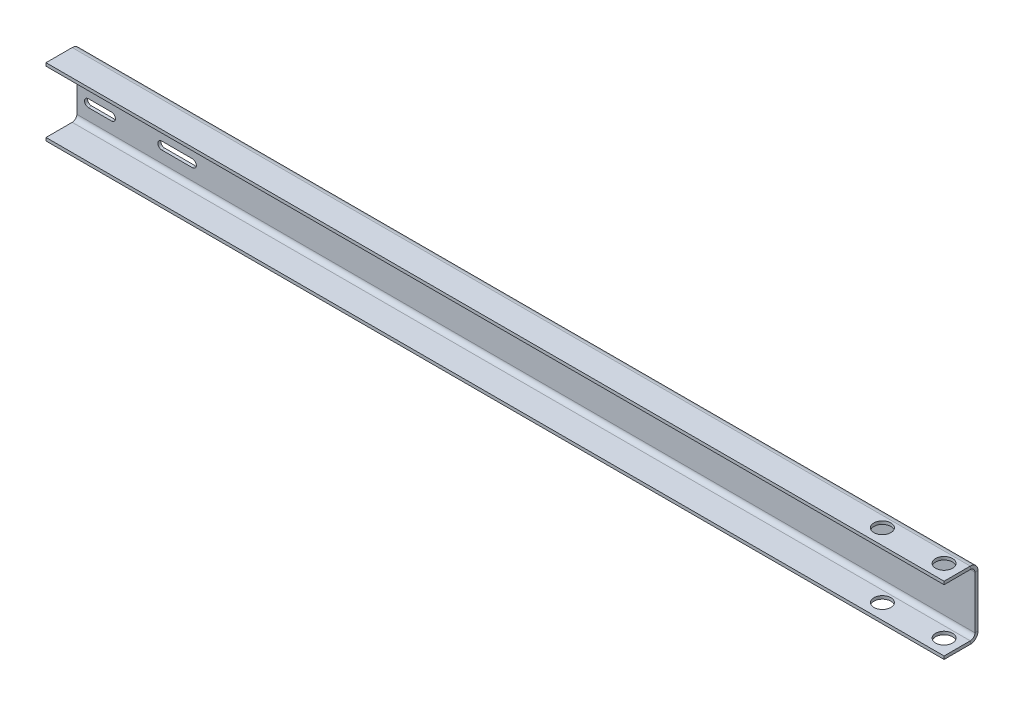
ISO-10303-21;
HEADER;
FILE_DESCRIPTION(('STEP AP214'),'2;1');
FILE_NAME('part.step','',(''),(''),'','','');
FILE_SCHEMA(('AUTOMOTIVE_DESIGN { 1 0 10303 214 1 1 1 1 }'));
ENDSEC;
DATA;
#1=APPLICATION_CONTEXT('core data for automotive mechanical design processes');
#2=APPLICATION_PROTOCOL_DEFINITION('international standard','automotive_design',2000,#1);
#3=PRODUCT_CONTEXT('',#1,'mechanical');
#4=PRODUCT('Part','Part','',(#3));
#5=PRODUCT_RELATED_PRODUCT_CATEGORY('part','',(#4));
#6=PRODUCT_DEFINITION_FORMATION('','',#4);
#7=PRODUCT_DEFINITION_CONTEXT('part definition',#1,'design');
#8=PRODUCT_DEFINITION('design','',#6,#7);
#9=PRODUCT_DEFINITION_SHAPE('','',#8);
#10=(LENGTH_UNIT() NAMED_UNIT(*) SI_UNIT(.MILLI.,.METRE.));
#11=(NAMED_UNIT(*) PLANE_ANGLE_UNIT() SI_UNIT($,.RADIAN.));
#12=(NAMED_UNIT(*) SI_UNIT($,.STERADIAN.) SOLID_ANGLE_UNIT());
#13=UNCERTAINTY_MEASURE_WITH_UNIT(LENGTH_MEASURE(1.E-05),#10,'distance_accuracy_value','');
#14=(GEOMETRIC_REPRESENTATION_CONTEXT(3) GLOBAL_UNCERTAINTY_ASSIGNED_CONTEXT((#13)) GLOBAL_UNIT_ASSIGNED_CONTEXT((#10,
#11,#12)) REPRESENTATION_CONTEXT('',''));
#15=CARTESIAN_POINT('',(0.,0.,0.));
#16=DIRECTION('',(0.,0.,1.));
#17=DIRECTION('',(1.,0.,0.));
#18=AXIS2_PLACEMENT_3D('',#15,#16,#17);
#19=CARTESIAN_POINT('',(0.,0.,-4.));
#20=DIRECTION('',(0.,0.,-1.));
#21=DIRECTION('',(-1.,0.,0.));
#22=AXIS2_PLACEMENT_3D('',#19,#20,#21);
#23=PLANE('',#22);
#24=CARTESIAN_POINT('',(-850.518987341773,29.9999999999999,-4.));
#25=DIRECTION('',(0.,0.,-1.));
#26=DIRECTION('',(-1.,0.,0.));
#27=AXIS2_PLACEMENT_3D('',#24,#25,#26);
#28=CIRCLE('',#27,5.);
#29=CARTESIAN_POINT('',(-850.518987341773,24.9999999999999,-4.));
#30=VERTEX_POINT('',#29);
#31=CARTESIAN_POINT('',(-850.518987341773,34.9999999999999,-4.));
#32=VERTEX_POINT('',#31);
#33=EDGE_CURVE('E96',#30,#32,#28,.T.);
#34=ORIENTED_EDGE('',*,*,#33,.F.);
#35=DIRECTION('',(-1.,0.,0.));
#36=VECTOR('',#35,1.);
#37=CARTESIAN_POINT('',(-850.518987341773,24.9999999999999,-4.));
#38=LINE('',#37,#36);
#39=CARTESIAN_POINT('',(-820.518987341773,24.9999999999999,-4.));
#40=VERTEX_POINT('',#39);
#41=EDGE_CURVE('E236',#40,#30,#38,.T.);
#42=ORIENTED_EDGE('',*,*,#41,.F.);
#43=CARTESIAN_POINT('',(-820.518987341773,29.9999999999999,-4.));
#44=DIRECTION('',(0.,0.,-1.));
#45=DIRECTION('',(-1.,0.,0.));
#46=AXIS2_PLACEMENT_3D('',#43,#44,#45);
#47=CIRCLE('',#46,5.);
#48=CARTESIAN_POINT('',(-820.518987341773,34.9999999999999,-4.));
#49=VERTEX_POINT('',#48);
#50=EDGE_CURVE('E221',#49,#40,#47,.T.);
#51=ORIENTED_EDGE('',*,*,#50,.F.);
#52=DIRECTION('',(1.,0.,0.));
#53=VECTOR('',#52,1.);
#54=CARTESIAN_POINT('',(-850.518987341773,34.9999999999999,-4.));
#55=LINE('',#54,#53);
#56=EDGE_CURVE('E230',#32,#49,#55,.T.);
#57=ORIENTED_EDGE('',*,*,#56,.F.);
#58=EDGE_LOOP('',(#34,#42,#51,#57));
#59=FACE_BOUND('',#58,.T.);
#60=CARTESIAN_POINT('',(-755.518987341773,29.9999999999999,-4.));
#61=DIRECTION('',(0.,0.,-1.));
#62=DIRECTION('',(-1.,0.,0.));
#63=AXIS2_PLACEMENT_3D('',#60,#61,#62);
#64=CIRCLE('',#63,4.99999999999999);
#65=CARTESIAN_POINT('',(-755.518987341773,24.9999999999999,-4.));
#66=VERTEX_POINT('',#65);
#67=CARTESIAN_POINT('',(-755.518987341773,34.9999999999999,-4.));
#68=VERTEX_POINT('',#67);
#69=EDGE_CURVE('E243',#66,#68,#64,.T.);
#70=ORIENTED_EDGE('',*,*,#69,.F.);
#71=DIRECTION('',(-1.,0.,0.));
#72=VECTOR('',#71,1.);
#73=CARTESIAN_POINT('',(-755.518987341773,24.9999999999999,-4.));
#74=LINE('',#73,#72);
#75=CARTESIAN_POINT('',(-715.518987341773,24.9999999999999,-4.));
#76=VERTEX_POINT('',#75);
#77=EDGE_CURVE('E253',#76,#66,#74,.T.);
#78=ORIENTED_EDGE('',*,*,#77,.F.);
#79=CARTESIAN_POINT('',(-715.518987341773,29.9999999999999,-4.));
#80=DIRECTION('',(0.,0.,-1.));
#81=DIRECTION('',(-1.,0.,0.));
#82=AXIS2_PLACEMENT_3D('',#79,#80,#81);
#83=CIRCLE('',#82,4.99999999999999);
#84=CARTESIAN_POINT('',(-715.518987341773,34.9999999999999,-4.));
#85=VERTEX_POINT('',#84);
#86=EDGE_CURVE('E250',#85,#76,#83,.T.);
#87=ORIENTED_EDGE('',*,*,#86,.F.);
#88=DIRECTION('',(1.,0.,0.));
#89=VECTOR('',#88,1.);
#90=CARTESIAN_POINT('',(-755.518987341773,34.9999999999999,-4.));
#91=LINE('',#90,#89);
#92=EDGE_CURVE('E247',#68,#85,#91,.T.);
#93=ORIENTED_EDGE('',*,*,#92,.F.);
#94=EDGE_LOOP('',(#70,#78,#87,#93));
#95=FACE_BOUND('',#94,.T.);
#96=DIRECTION('',(0.,1.,0.));
#97=VECTOR('',#96,1.);
#98=CARTESIAN_POINT('',(299.481012658227,88.0000000000001,-4.));
#99=LINE('',#98,#97);
#100=CARTESIAN_POINT('',(299.481012658227,9.99999999999995,-3.99999999999989));
#101=VERTEX_POINT('',#100);
#102=CARTESIAN_POINT('',(299.481012658227,78.,-4.));
#103=VERTEX_POINT('',#102);
#104=EDGE_CURVE('E397',#101,#103,#99,.T.);
#105=ORIENTED_EDGE('',*,*,#104,.F.);
#106=DIRECTION('',(1.,0.,0.));
#107=VECTOR('',#106,1.);
#108=CARTESIAN_POINT('',(299.481012658227,9.99999999999995,-3.99999999999989));
#109=LINE('',#108,#107);
#110=CARTESIAN_POINT('',(-865.518987341773,9.99999999999971,-4.));
#111=VERTEX_POINT('',#110);
#112=EDGE_CURVE('E318',#101,#111,#109,.F.);
#113=ORIENTED_EDGE('',*,*,#112,.T.);
#114=DIRECTION('',(0.,-1.,0.));
#115=VECTOR('',#114,1.);
#116=CARTESIAN_POINT('',(-865.518987341773,88.,-4.));
#117=LINE('',#116,#115);
#118=CARTESIAN_POINT('',(-865.518987341773,78.,-4.00000000000006));
#119=VERTEX_POINT('',#118);
#120=EDGE_CURVE('E399',#119,#111,#117,.T.);
#121=ORIENTED_EDGE('',*,*,#120,.F.);
#122=DIRECTION('',(-1.,0.,0.));
#123=VECTOR('',#122,1.);
#124=CARTESIAN_POINT('',(-865.518987341773,78.,-4.00000000000006));
#125=LINE('',#124,#123);
#126=EDGE_CURVE('E373',#119,#103,#125,.F.);
#127=ORIENTED_EDGE('',*,*,#126,.T.);
#128=EDGE_LOOP('',(#105,#113,#121,#127));
#129=FACE_BOUND('',#128,.T.);
#130=ADVANCED_FACE('F81',(#59,#95,#129),#23,.T.);
#131=CARTESIAN_POINT('',(0.,0.,0.));
#132=DIRECTION('',(0.,0.,-1.));
#133=DIRECTION('',(-1.,0.,0.));
#134=AXIS2_PLACEMENT_3D('',#131,#132,#133);
#135=PLANE('',#134);
#136=DIRECTION('',(-1.,0.,0.));
#137=VECTOR('',#136,1.);
#138=CARTESIAN_POINT('',(0.,24.9999999999999,0.));
#139=LINE('',#138,#137);
#140=CARTESIAN_POINT('',(-820.518987341773,24.9999999999999,0.));
#141=VERTEX_POINT('',#140);
#142=CARTESIAN_POINT('',(-850.518987341773,24.9999999999999,0.));
#143=VERTEX_POINT('',#142);
#144=EDGE_CURVE('E89',#141,#143,#139,.T.);
#145=ORIENTED_EDGE('',*,*,#144,.T.);
#146=CARTESIAN_POINT('',(-850.518987341773,29.9999999999999,0.));
#147=DIRECTION('',(0.,0.,-1.));
#148=DIRECTION('',(-1.,0.,0.));
#149=AXIS2_PLACEMENT_3D('',#146,#147,#148);
#150=CIRCLE('',#149,5.);
#151=CARTESIAN_POINT('',(-850.518987341773,34.9999999999999,0.));
#152=VERTEX_POINT('',#151);
#153=EDGE_CURVE('E13',#143,#152,#150,.T.);
#154=ORIENTED_EDGE('',*,*,#153,.T.);
#155=DIRECTION('',(1.,0.,0.));
#156=VECTOR('',#155,1.);
#157=CARTESIAN_POINT('',(0.,34.9999999999995,0.));
#158=LINE('',#157,#156);
#159=CARTESIAN_POINT('',(-820.518987341773,34.9999999999999,0.));
#160=VERTEX_POINT('',#159);
#161=EDGE_CURVE('E422',#152,#160,#158,.T.);
#162=ORIENTED_EDGE('',*,*,#161,.T.);
#163=CARTESIAN_POINT('',(-820.518987341773,29.9999999999999,0.));
#164=DIRECTION('',(0.,0.,-1.));
#165=DIRECTION('',(-1.,0.,0.));
#166=AXIS2_PLACEMENT_3D('',#163,#164,#165);
#167=CIRCLE('',#166,5.);
#168=EDGE_CURVE('E224',#160,#141,#167,.T.);
#169=ORIENTED_EDGE('',*,*,#168,.T.);
#170=EDGE_LOOP('',(#145,#154,#162,#169));
#171=FACE_BOUND('',#170,.T.);
#172=DIRECTION('',(-1.,0.,0.));
#173=VECTOR('',#172,1.);
#174=CARTESIAN_POINT('',(0.,24.9999999999998,0.));
#175=LINE('',#174,#173);
#176=CARTESIAN_POINT('',(-715.518987341773,24.9999999999999,0.));
#177=VERTEX_POINT('',#176);
#178=CARTESIAN_POINT('',(-755.518987341773,24.9999999999999,0.));
#179=VERTEX_POINT('',#178);
#180=EDGE_CURVE('E416',#177,#179,#175,.T.);
#181=ORIENTED_EDGE('',*,*,#180,.T.);
#182=CARTESIAN_POINT('',(-755.518987341773,29.9999999999999,0.));
#183=DIRECTION('',(0.,0.,-1.));
#184=DIRECTION('',(-1.,0.,0.));
#185=AXIS2_PLACEMENT_3D('',#182,#183,#184);
#186=CIRCLE('',#185,4.99999999999999);
#187=CARTESIAN_POINT('',(-755.518987341773,34.9999999999999,0.));
#188=VERTEX_POINT('',#187);
#189=EDGE_CURVE('E419',#179,#188,#186,.T.);
#190=ORIENTED_EDGE('',*,*,#189,.T.);
#191=DIRECTION('',(1.,0.,0.));
#192=VECTOR('',#191,1.);
#193=CARTESIAN_POINT('',(0.,34.9999999999997,0.));
#194=LINE('',#193,#192);
#195=CARTESIAN_POINT('',(-715.518987341773,34.9999999999999,0.));
#196=VERTEX_POINT('',#195);
#197=EDGE_CURVE('E403',#188,#196,#194,.T.);
#198=ORIENTED_EDGE('',*,*,#197,.T.);
#199=CARTESIAN_POINT('',(-715.518987341773,29.9999999999999,0.));
#200=DIRECTION('',(0.,0.,-1.));
#201=DIRECTION('',(-1.,0.,0.));
#202=AXIS2_PLACEMENT_3D('',#199,#200,#201);
#203=CIRCLE('',#202,4.99999999999999);
#204=EDGE_CURVE('E413',#196,#177,#203,.T.);
#205=ORIENTED_EDGE('',*,*,#204,.T.);
#206=EDGE_LOOP('',(#181,#190,#198,#205));
#207=FACE_BOUND('',#206,.T.);
#208=DIRECTION('',(1.,0.,0.));
#209=VECTOR('',#208,1.);
#210=CARTESIAN_POINT('',(299.481012658227,10.,1.14491749414469E-13));
#211=LINE('',#210,#209);
#212=CARTESIAN_POINT('',(299.481012658227,10.,1.14491749414469E-13));
#213=VERTEX_POINT('',#212);
#214=CARTESIAN_POINT('',(-865.518987341773,9.99999999999968,1.14491749414469E-13));
#215=VERTEX_POINT('',#214);
#216=EDGE_CURVE('E331',#213,#215,#211,.F.);
#217=ORIENTED_EDGE('',*,*,#216,.F.);
#218=DIRECTION('',(0.,1.,0.));
#219=VECTOR('',#218,1.);
#220=CARTESIAN_POINT('',(299.481012658227,88.0000000000001,0.));
#221=LINE('',#220,#219);
#222=CARTESIAN_POINT('',(299.481012658227,78.,0.));
#223=VERTEX_POINT('',#222);
#224=EDGE_CURVE('E394',#213,#223,#221,.T.);
#225=ORIENTED_EDGE('',*,*,#224,.T.);
#226=DIRECTION('',(-1.,0.,0.));
#227=VECTOR('',#226,1.);
#228=CARTESIAN_POINT('',(-865.518987341773,78.,0.));
#229=LINE('',#228,#227);
#230=CARTESIAN_POINT('',(-865.518987341773,78.,0.));
#231=VERTEX_POINT('',#230);
#232=EDGE_CURVE('E386',#231,#223,#229,.F.);
#233=ORIENTED_EDGE('',*,*,#232,.F.);
#234=DIRECTION('',(0.,-1.,0.));
#235=VECTOR('',#234,1.);
#236=CARTESIAN_POINT('',(-865.518987341773,88.,0.));
#237=LINE('',#236,#235);
#238=EDGE_CURVE('E400',#231,#215,#237,.T.);
#239=ORIENTED_EDGE('',*,*,#238,.T.);
#240=EDGE_LOOP('',(#217,#225,#233,#239));
#241=FACE_BOUND('',#240,.T.);
#242=ADVANCED_FACE('F426',(#171,#207,#241),#135,.F.);
#243=CARTESIAN_POINT('',(299.481012658227,88.0000000000001,-4.));
#244=DIRECTION('',(1.,0.,0.));
#245=DIRECTION('',(0.,0.,-1.));
#246=AXIS2_PLACEMENT_3D('',#243,#244,#245);
#247=PLANE('',#246);
#248=ORIENTED_EDGE('',*,*,#224,.F.);
#249=DIRECTION('',(0.,0.,-1.));
#250=VECTOR('',#249,1.);
#251=CARTESIAN_POINT('',(299.481012658227,10.,1.14491749414469E-13));
#252=LINE('',#251,#250);
#253=EDGE_CURVE('E325',#213,#101,#252,.T.);
#254=ORIENTED_EDGE('',*,*,#253,.T.);
#255=ORIENTED_EDGE('',*,*,#104,.T.);
#256=DIRECTION('',(0.,0.,-1.));
#257=VECTOR('',#256,1.);
#258=CARTESIAN_POINT('',(299.481012658227,78.,0.));
#259=LINE('',#258,#257);
#260=EDGE_CURVE('E391',#223,#103,#259,.T.);
#261=ORIENTED_EDGE('',*,*,#260,.F.);
#262=EDGE_LOOP('',(#248,#254,#255,#261));
#263=FACE_BOUND('',#262,.T.);
#264=ADVANCED_FACE('F83',(#263),#247,.T.);
#265=CARTESIAN_POINT('',(-865.518987341773,88.,-4.));
#266=DIRECTION('',(-1.,0.,0.));
#267=DIRECTION('',(0.,0.,1.));
#268=AXIS2_PLACEMENT_3D('',#265,#266,#267);
#269=PLANE('',#268);
#270=DIRECTION('',(0.,0.,-1.));
#271=VECTOR('',#270,1.);
#272=CARTESIAN_POINT('',(-865.518987341773,9.99999999999968,1.14491749414469E-13));
#273=LINE('',#272,#271);
#274=EDGE_CURVE('E335',#215,#111,#273,.T.);
#275=ORIENTED_EDGE('',*,*,#274,.F.);
#276=ORIENTED_EDGE('',*,*,#238,.F.);
#277=DIRECTION('',(0.,0.,-1.));
#278=VECTOR('',#277,1.);
#279=CARTESIAN_POINT('',(-865.518987341773,78.,0.));
#280=LINE('',#279,#278);
#281=EDGE_CURVE('E380',#231,#119,#280,.T.);
#282=ORIENTED_EDGE('',*,*,#281,.T.);
#283=ORIENTED_EDGE('',*,*,#120,.T.);
#284=EDGE_LOOP('',(#275,#276,#282,#283));
#285=FACE_BOUND('',#284,.T.);
#286=ADVANCED_FACE('F454',(#285),#269,.T.);
#287=CARTESIAN_POINT('',(299.481012658227,78.0000000000001,6.00000000000001));
#288=DIRECTION('',(1.,0.,0.));
#289=DIRECTION('',(0.,0.,-1.));
#290=AXIS2_PLACEMENT_3D('',#287,#288,#289);
#291=PLANE('',#290);
#292=DIRECTION('',(0.,1.,0.));
#293=VECTOR('',#292,1.);
#294=CARTESIAN_POINT('',(299.481012658227,88.0000000000001,5.99999999999996));
#295=LINE('',#294,#293);
#296=CARTESIAN_POINT('',(299.481012658227,84.0000000000001,5.99999999999999));
#297=VERTEX_POINT('',#296);
#298=CARTESIAN_POINT('',(299.481012658227,88.0000000000001,5.99999999999998));
#299=VERTEX_POINT('',#298);
#300=EDGE_CURVE('E338',#297,#299,#295,.T.);
#301=ORIENTED_EDGE('',*,*,#300,.F.);
#302=CARTESIAN_POINT('',(299.481012658227,78.0000000000001,6.00000000000001));
#303=DIRECTION('',(-1.,0.,0.));
#304=DIRECTION('',(0.,0.,1.));
#305=AXIS2_PLACEMENT_3D('',#302,#303,#304);
#306=CIRCLE('',#305,6.00000000000007);
#307=EDGE_CURVE('E383',#223,#297,#306,.F.);
#308=ORIENTED_EDGE('',*,*,#307,.F.);
#309=ORIENTED_EDGE('',*,*,#260,.T.);
#310=CARTESIAN_POINT('',(299.481012658227,78.0000000000001,6.00000000000001));
#311=DIRECTION('',(-1.,0.,0.));
#312=DIRECTION('',(0.,0.,1.));
#313=AXIS2_PLACEMENT_3D('',#310,#311,#312);
#314=CIRCLE('',#313,10.0000000000001);
#315=EDGE_CURVE('E376',#103,#299,#314,.F.);
#316=ORIENTED_EDGE('',*,*,#315,.T.);
#317=EDGE_LOOP('',(#301,#308,#309,#316));
#318=FACE_BOUND('',#317,.T.);
#319=ADVANCED_FACE('F456',(#318),#291,.T.);
#320=CARTESIAN_POINT('',(-865.518987341773,78.0000000000001,6.00000000000001));
#321=DIRECTION('',(1.,0.,0.));
#322=DIRECTION('',(0.,0.,-1.));
#323=AXIS2_PLACEMENT_3D('',#320,#321,#322);
#324=PLANE('',#323);
#325=CARTESIAN_POINT('',(-865.518987341773,78.0000000000001,6.00000000000001));
#326=DIRECTION('',(-1.,0.,0.));
#327=DIRECTION('',(0.,0.,1.));
#328=AXIS2_PLACEMENT_3D('',#325,#326,#327);
#329=CIRCLE('',#328,6.00000000000007);
#330=CARTESIAN_POINT('',(-865.518987341773,84.0000000000001,5.99999999999999));
#331=VERTEX_POINT('',#330);
#332=EDGE_CURVE('E343',#331,#231,#329,.T.);
#333=ORIENTED_EDGE('',*,*,#332,.F.);
#334=DIRECTION('',(0.,1.,0.));
#335=VECTOR('',#334,1.);
#336=CARTESIAN_POINT('',(-865.518987341773,84.,6.00000000000001));
#337=LINE('',#336,#335);
#338=CARTESIAN_POINT('',(-865.518987341773,88.,5.99999999999999));
#339=VERTEX_POINT('',#338);
#340=EDGE_CURVE('E366',#331,#339,#337,.T.);
#341=ORIENTED_EDGE('',*,*,#340,.T.);
#342=CARTESIAN_POINT('',(-865.518987341773,78.0000000000001,6.00000000000001));
#343=DIRECTION('',(-1.,0.,0.));
#344=DIRECTION('',(0.,0.,1.));
#345=AXIS2_PLACEMENT_3D('',#342,#343,#344);
#346=CIRCLE('',#345,10.0000000000001);
#347=EDGE_CURVE('E377',#339,#119,#346,.T.);
#348=ORIENTED_EDGE('',*,*,#347,.T.);
#349=ORIENTED_EDGE('',*,*,#281,.F.);
#350=EDGE_LOOP('',(#333,#341,#348,#349));
#351=FACE_BOUND('',#350,.T.);
#352=ADVANCED_FACE('F452',(#351),#324,.F.);
#353=CARTESIAN_POINT('',(-865.518987341773,78.0000000000001,6.00000000000001));
#354=DIRECTION('',(-1.,0.,0.));
#355=DIRECTION('',(0.,1.,0.));
#356=AXIS2_PLACEMENT_3D('',#353,#354,#355);
#357=CYLINDRICAL_SURFACE('',#356,10.0000000000001);
#358=ORIENTED_EDGE('',*,*,#126,.F.);
#359=ORIENTED_EDGE('',*,*,#347,.F.);
#360=DIRECTION('',(-1.,0.,0.));
#361=VECTOR('',#360,1.);
#362=CARTESIAN_POINT('',(0.,88.0000000000001,5.99999999999997));
#363=LINE('',#362,#361);
#364=EDGE_CURVE('E363',#299,#339,#363,.T.);
#365=ORIENTED_EDGE('',*,*,#364,.F.);
#366=ORIENTED_EDGE('',*,*,#315,.F.);
#367=EDGE_LOOP('',(#358,#359,#365,#366));
#368=FACE_BOUND('',#367,.T.);
#369=ADVANCED_FACE('F483',(#368),#357,.T.);
#370=CARTESIAN_POINT('',(-865.518987341773,78.0000000000001,6.00000000000001));
#371=DIRECTION('',(-1.,0.,0.));
#372=DIRECTION('',(0.,1.,0.));
#373=AXIS2_PLACEMENT_3D('',#370,#371,#372);
#374=CYLINDRICAL_SURFACE('',#373,6.00000000000007);
#375=ORIENTED_EDGE('',*,*,#232,.T.);
#376=ORIENTED_EDGE('',*,*,#307,.T.);
#377=DIRECTION('',(1.,0.,0.));
#378=VECTOR('',#377,1.);
#379=CARTESIAN_POINT('',(299.481012658227,84.0000000000001,5.99999999999998));
#380=LINE('',#379,#378);
#381=EDGE_CURVE('E369',#297,#331,#380,.F.);
#382=ORIENTED_EDGE('',*,*,#381,.T.);
#383=ORIENTED_EDGE('',*,*,#332,.T.);
#384=EDGE_LOOP('',(#375,#376,#382,#383));
#385=FACE_BOUND('',#384,.T.);
#386=ADVANCED_FACE('F475',(#385),#374,.F.);
#387=CARTESIAN_POINT('',(-865.518987341773,88.,0.));
#388=DIRECTION('',(-1.,0.,0.));
#389=DIRECTION('',(0.,-1.,0.));
#390=AXIS2_PLACEMENT_3D('',#387,#388,#389);
#391=PLANE('',#390);
#392=DIRECTION('',(0.,0.,-1.));
#393=VECTOR('',#392,1.);
#394=CARTESIAN_POINT('',(-865.518987341773,88.,0.));
#395=LINE('',#394,#393);
#396=CARTESIAN_POINT('',(-865.518987341773,88.0000000000001,40.));
#397=VERTEX_POINT('',#396);
#398=EDGE_CURVE('E347',#397,#339,#395,.T.);
#399=ORIENTED_EDGE('',*,*,#398,.T.);
#400=ORIENTED_EDGE('',*,*,#340,.F.);
#401=DIRECTION('',(0.,0.,1.));
#402=VECTOR('',#401,1.);
#403=CARTESIAN_POINT('',(-865.518987341773,84.,-3.05311331771918E-13));
#404=LINE('',#403,#402);
#405=CARTESIAN_POINT('',(-865.518987341773,84.0000000000001,40.));
#406=VERTEX_POINT('',#405);
#407=EDGE_CURVE('E355',#406,#331,#404,.F.);
#408=ORIENTED_EDGE('',*,*,#407,.F.);
#409=DIRECTION('',(0.,-1.,0.));
#410=VECTOR('',#409,1.);
#411=CARTESIAN_POINT('',(-865.518987341773,88.0000000000001,40.));
#412=LINE('',#411,#410);
#413=EDGE_CURVE('E341',#397,#406,#412,.T.);
#414=ORIENTED_EDGE('',*,*,#413,.F.);
#415=EDGE_LOOP('',(#399,#400,#408,#414));
#416=FACE_BOUND('',#415,.T.);
#417=ADVANCED_FACE('F501',(#416),#391,.T.);
#418=CARTESIAN_POINT('',(299.481012658227,88.0000000000003,40.));
#419=DIRECTION('',(1.,0.,0.));
#420=DIRECTION('',(0.,1.,0.));
#421=AXIS2_PLACEMENT_3D('',#418,#419,#420);
#422=PLANE('',#421);
#423=DIRECTION('',(0.,0.,-1.));
#424=VECTOR('',#423,1.);
#425=CARTESIAN_POINT('',(299.481012658227,84.0000000000001,-3.05311331771918E-13));
#426=LINE('',#425,#424);
#427=CARTESIAN_POINT('',(299.481012658227,84.0000000000003,40.));
#428=VERTEX_POINT('',#427);
#429=EDGE_CURVE('E361',#297,#428,#426,.F.);
#430=ORIENTED_EDGE('',*,*,#429,.F.);
#431=ORIENTED_EDGE('',*,*,#300,.T.);
#432=DIRECTION('',(0.,0.,1.));
#433=VECTOR('',#432,1.);
#434=CARTESIAN_POINT('',(299.481012658227,88.0000000000003,40.));
#435=LINE('',#434,#433);
#436=CARTESIAN_POINT('',(299.481012658227,88.0000000000003,40.));
#437=VERTEX_POINT('',#436);
#438=EDGE_CURVE('E353',#299,#437,#435,.T.);
#439=ORIENTED_EDGE('',*,*,#438,.T.);
#440=DIRECTION('',(0.,-1.,0.));
#441=VECTOR('',#440,1.);
#442=CARTESIAN_POINT('',(299.481012658227,88.0000000000003,40.));
#443=LINE('',#442,#441);
#444=EDGE_CURVE('E344',#437,#428,#443,.T.);
#445=ORIENTED_EDGE('',*,*,#444,.T.);
#446=EDGE_LOOP('',(#430,#431,#439,#445));
#447=FACE_BOUND('',#446,.T.);
#448=ADVANCED_FACE('F487',(#447),#422,.T.);
#449=CARTESIAN_POINT('',(0.,88.0000000000001,-3.19277257127291E-13));
#450=DIRECTION('',(0.,1.,0.));
#451=DIRECTION('',(0.,0.,1.));
#452=AXIS2_PLACEMENT_3D('',#449,#450,#451);
#453=PLANE('',#452);
#454=CARTESIAN_POINT('',(199.481012658227,88.0000000000005,20.0000000000003));
#455=DIRECTION('',(0.,-1.,0.));
#456=DIRECTION('',(0.,0.,-1.));
#457=AXIS2_PLACEMENT_3D('',#454,#455,#456);
#458=CIRCLE('',#457,11.);
#459=CARTESIAN_POINT('',(199.481012658227,88.0000000000005,9.00000000000031));
#460=VERTEX_POINT('',#459);
#461=EDGE_CURVE('E259',#460,#460,#458,.T.);
#462=ORIENTED_EDGE('',*,*,#461,.T.);
#463=EDGE_LOOP('',(#462));
#464=FACE_BOUND('',#463,.T.);
#465=CARTESIAN_POINT('',(279.481012658227,88.0000000000005,20.0000000000003));
#466=DIRECTION('',(0.,-1.,0.));
#467=DIRECTION('',(0.,0.,-1.));
#468=AXIS2_PLACEMENT_3D('',#465,#466,#467);
#469=CIRCLE('',#468,11.);
#470=CARTESIAN_POINT('',(279.481012658227,88.0000000000005,9.00000000000028));
#471=VERTEX_POINT('',#470);
#472=EDGE_CURVE('E275',#471,#471,#469,.T.);
#473=ORIENTED_EDGE('',*,*,#472,.T.);
#474=EDGE_LOOP('',(#473));
#475=FACE_BOUND('',#474,.T.);
#476=ORIENTED_EDGE('',*,*,#438,.F.);
#477=ORIENTED_EDGE('',*,*,#364,.T.);
#478=ORIENTED_EDGE('',*,*,#398,.F.);
#479=DIRECTION('',(-1.,0.,0.));
#480=VECTOR('',#479,1.);
#481=CARTESIAN_POINT('',(-865.518987341773,88.0000000000001,40.));
#482=LINE('',#481,#480);
#483=EDGE_CURVE('E350',#437,#397,#482,.T.);
#484=ORIENTED_EDGE('',*,*,#483,.F.);
#485=EDGE_LOOP('',(#476,#477,#478,#484));
#486=FACE_BOUND('',#485,.T.);
#487=ADVANCED_FACE('F491',(#464,#475,#486),#453,.T.);
#488=CARTESIAN_POINT('',(0.,84.0000000000001,-3.05311331771918E-13));
#489=DIRECTION('',(0.,1.,0.));
#490=DIRECTION('',(0.,0.,1.));
#491=AXIS2_PLACEMENT_3D('',#488,#489,#490);
#492=PLANE('',#491);
#493=CARTESIAN_POINT('',(199.481012658227,84.0000000000002,20.0000000000003));
#494=DIRECTION('',(0.,1.,0.));
#495=DIRECTION('',(0.,0.,1.));
#496=AXIS2_PLACEMENT_3D('',#493,#494,#495);
#497=CIRCLE('',#496,11.);
#498=CARTESIAN_POINT('',(199.481012658227,84.0000000000002,31.0000000000003));
#499=VERTEX_POINT('',#498);
#500=EDGE_CURVE('E272',#499,#499,#497,.T.);
#501=ORIENTED_EDGE('',*,*,#500,.T.);
#502=EDGE_LOOP('',(#501));
#503=FACE_BOUND('',#502,.T.);
#504=CARTESIAN_POINT('',(279.481012658227,84.0000000000002,20.0000000000003));
#505=DIRECTION('',(0.,1.,0.));
#506=DIRECTION('',(0.,0.,1.));
#507=AXIS2_PLACEMENT_3D('',#504,#505,#506);
#508=CIRCLE('',#507,11.);
#509=CARTESIAN_POINT('',(279.481012658227,84.0000000000002,31.0000000000003));
#510=VERTEX_POINT('',#509);
#511=EDGE_CURVE('E282',#510,#510,#508,.T.);
#512=ORIENTED_EDGE('',*,*,#511,.T.);
#513=EDGE_LOOP('',(#512));
#514=FACE_BOUND('',#513,.T.);
#515=ORIENTED_EDGE('',*,*,#381,.F.);
#516=ORIENTED_EDGE('',*,*,#429,.T.);
#517=DIRECTION('',(1.,0.,0.));
#518=VECTOR('',#517,1.);
#519=CARTESIAN_POINT('',(0.,84.0000000000002,40.));
#520=LINE('',#519,#518);
#521=EDGE_CURVE('E358',#428,#406,#520,.F.);
#522=ORIENTED_EDGE('',*,*,#521,.T.);
#523=ORIENTED_EDGE('',*,*,#407,.T.);
#524=EDGE_LOOP('',(#515,#516,#522,#523));
#525=FACE_BOUND('',#524,.T.);
#526=ADVANCED_FACE('F498',(#503,#514,#525),#492,.F.);
#527=CARTESIAN_POINT('',(-865.518987341773,88.0000000000001,40.));
#528=DIRECTION('',(0.,0.,1.));
#529=DIRECTION('',(0.,-1.,0.));
#530=AXIS2_PLACEMENT_3D('',#527,#528,#529);
#531=PLANE('',#530);
#532=ORIENTED_EDGE('',*,*,#521,.F.);
#533=ORIENTED_EDGE('',*,*,#444,.F.);
#534=ORIENTED_EDGE('',*,*,#483,.T.);
#535=ORIENTED_EDGE('',*,*,#413,.T.);
#536=EDGE_LOOP('',(#532,#533,#534,#535));
#537=FACE_BOUND('',#536,.T.);
#538=ADVANCED_FACE('F495',(#537),#531,.T.);
#539=CARTESIAN_POINT('',(-865.518987341773,9.99999999999978,6.00000000000002));
#540=DIRECTION('',(-1.,0.,0.));
#541=DIRECTION('',(0.,-1.,0.));
#542=AXIS2_PLACEMENT_3D('',#539,#540,#541);
#543=PLANE('',#542);
#544=DIRECTION('',(0.,-1.,0.));
#545=VECTOR('',#544,1.);
#546=CARTESIAN_POINT('',(-865.518987341773,-1.26753006330052E-13,5.99999999999996));
#547=LINE('',#546,#545);
#548=CARTESIAN_POINT('',(-865.518987341773,3.99999999999987,6.));
#549=VERTEX_POINT('',#548);
#550=CARTESIAN_POINT('',(-865.518987341773,-1.26634813746307E-13,5.99999999999998));
#551=VERTEX_POINT('',#550);
#552=EDGE_CURVE('E285',#549,#551,#547,.T.);
#553=ORIENTED_EDGE('',*,*,#552,.F.);
#554=CARTESIAN_POINT('',(-865.518987341773,9.99999999999978,6.00000000000002));
#555=DIRECTION('',(1.,0.,0.));
#556=DIRECTION('',(0.,1.,0.));
#557=AXIS2_PLACEMENT_3D('',#554,#555,#556);
#558=CIRCLE('',#557,5.9999999999999);
#559=EDGE_CURVE('E328',#215,#549,#558,.F.);
#560=ORIENTED_EDGE('',*,*,#559,.F.);
#561=ORIENTED_EDGE('',*,*,#274,.T.);
#562=CARTESIAN_POINT('',(-865.518987341773,9.99999999999978,6.00000000000002));
#563=DIRECTION('',(1.,0.,0.));
#564=DIRECTION('',(0.,1.,0.));
#565=AXIS2_PLACEMENT_3D('',#562,#563,#564);
#566=CIRCLE('',#565,9.9999999999999);
#567=EDGE_CURVE('E321',#111,#551,#566,.F.);
#568=ORIENTED_EDGE('',*,*,#567,.T.);
#569=EDGE_LOOP('',(#553,#560,#561,#568));
#570=FACE_BOUND('',#569,.T.);
#571=ADVANCED_FACE('F524',(#570),#543,.T.);
#572=CARTESIAN_POINT('',(299.481012658227,10.0000000000001,6.00000000000002));
#573=DIRECTION('',(-1.,0.,0.));
#574=DIRECTION('',(0.,-1.,0.));
#575=AXIS2_PLACEMENT_3D('',#572,#573,#574);
#576=PLANE('',#575);
#577=CARTESIAN_POINT('',(299.481012658227,10.0000000000001,6.00000000000002));
#578=DIRECTION('',(1.,0.,0.));
#579=DIRECTION('',(0.,1.,0.));
#580=AXIS2_PLACEMENT_3D('',#577,#578,#579);
#581=CIRCLE('',#580,5.9999999999999);
#582=CARTESIAN_POINT('',(299.481012658227,4.00000000000021,6.));
#583=VERTEX_POINT('',#582);
#584=EDGE_CURVE('E288',#583,#213,#581,.T.);
#585=ORIENTED_EDGE('',*,*,#584,.F.);
#586=DIRECTION('',(0.,-1.,0.));
#587=VECTOR('',#586,1.);
#588=CARTESIAN_POINT('',(299.481012658227,4.00000000000002,6.00000000000002));
#589=LINE('',#588,#587);
#590=CARTESIAN_POINT('',(299.481012658227,0.,6.));
#591=VERTEX_POINT('',#590);
#592=EDGE_CURVE('E311',#583,#591,#589,.T.);
#593=ORIENTED_EDGE('',*,*,#592,.T.);
#594=CARTESIAN_POINT('',(299.481012658227,10.0000000000001,6.00000000000002));
#595=DIRECTION('',(1.,0.,0.));
#596=DIRECTION('',(0.,1.,0.));
#597=AXIS2_PLACEMENT_3D('',#594,#595,#596);
#598=CIRCLE('',#597,9.9999999999999);
#599=EDGE_CURVE('E322',#591,#101,#598,.T.);
#600=ORIENTED_EDGE('',*,*,#599,.T.);
#601=ORIENTED_EDGE('',*,*,#253,.F.);
#602=EDGE_LOOP('',(#585,#593,#600,#601));
#603=FACE_BOUND('',#602,.T.);
#604=ADVANCED_FACE('F507',(#603),#576,.F.);
#605=CARTESIAN_POINT('',(299.481012658227,10.0000000000001,6.00000000000002));
#606=DIRECTION('',(1.,0.,0.));
#607=DIRECTION('',(0.,-1.,0.));
#608=AXIS2_PLACEMENT_3D('',#605,#606,#607);
#609=CYLINDRICAL_SURFACE('',#608,9.9999999999999);
#610=ORIENTED_EDGE('',*,*,#112,.F.);
#611=ORIENTED_EDGE('',*,*,#599,.F.);
#612=DIRECTION('',(1.,0.,0.));
#613=VECTOR('',#612,1.);
#614=CARTESIAN_POINT('',(0.,0.,5.99999999999999));
#615=LINE('',#614,#613);
#616=EDGE_CURVE('E308',#551,#591,#615,.T.);
#617=ORIENTED_EDGE('',*,*,#616,.F.);
#618=ORIENTED_EDGE('',*,*,#567,.F.);
#619=EDGE_LOOP('',(#610,#611,#617,#618));
#620=FACE_BOUND('',#619,.T.);
#621=ADVANCED_FACE('F504',(#620),#609,.T.);
#622=CARTESIAN_POINT('',(299.481012658227,10.0000000000001,6.00000000000002));
#623=DIRECTION('',(1.,0.,0.));
#624=DIRECTION('',(0.,-1.,0.));
#625=AXIS2_PLACEMENT_3D('',#622,#623,#624);
#626=CYLINDRICAL_SURFACE('',#625,5.9999999999999);
#627=ORIENTED_EDGE('',*,*,#216,.T.);
#628=ORIENTED_EDGE('',*,*,#559,.T.);
#629=DIRECTION('',(-1.,0.,0.));
#630=VECTOR('',#629,1.);
#631=CARTESIAN_POINT('',(-865.518987341773,3.99999999999987,5.99999999999998));
#632=LINE('',#631,#630);
#633=EDGE_CURVE('E314',#549,#583,#632,.F.);
#634=ORIENTED_EDGE('',*,*,#633,.T.);
#635=ORIENTED_EDGE('',*,*,#584,.T.);
#636=EDGE_LOOP('',(#627,#628,#634,#635));
#637=FACE_BOUND('',#636,.T.);
#638=ADVANCED_FACE('F527',(#637),#626,.F.);
#639=CARTESIAN_POINT('',(299.481012658227,0.,0.));
#640=DIRECTION('',(1.,0.,0.));
#641=DIRECTION('',(0.,1.,0.));
#642=AXIS2_PLACEMENT_3D('',#639,#640,#641);
#643=PLANE('',#642);
#644=DIRECTION('',(0.,0.,-1.));
#645=VECTOR('',#644,1.);
#646=CARTESIAN_POINT('',(299.481012658227,0.,0.));
#647=LINE('',#646,#645);
#648=CARTESIAN_POINT('',(299.481012658227,-1.02983407197995E-13,40.));
#649=VERTEX_POINT('',#648);
#650=EDGE_CURVE('E292',#649,#591,#647,.T.);
#651=ORIENTED_EDGE('',*,*,#650,.T.);
#652=ORIENTED_EDGE('',*,*,#592,.F.);
#653=DIRECTION('',(0.,0.,1.));
#654=VECTOR('',#653,1.);
#655=CARTESIAN_POINT('',(299.481012658227,4.00000000000004,0.));
#656=LINE('',#655,#654);
#657=CARTESIAN_POINT('',(299.481012658227,3.9999999999999,40.));
#658=VERTEX_POINT('',#657);
#659=EDGE_CURVE('E300',#658,#583,#656,.F.);
#660=ORIENTED_EDGE('',*,*,#659,.F.);
#661=DIRECTION('',(0.,1.,0.));
#662=VECTOR('',#661,1.);
#663=CARTESIAN_POINT('',(299.481012658227,-1.0321604682062E-13,40.));
#664=LINE('',#663,#662);
#665=EDGE_CURVE('E286',#649,#658,#664,.T.);
#666=ORIENTED_EDGE('',*,*,#665,.F.);
#667=EDGE_LOOP('',(#651,#652,#660,#666));
#668=FACE_BOUND('',#667,.T.);
#669=ADVANCED_FACE('F516',(#668),#643,.T.);
#670=CARTESIAN_POINT('',(-865.518987341773,-2.45463371850718E-13,40.));
#671=DIRECTION('',(-1.,0.,0.));
#672=DIRECTION('',(0.,-1.,0.));
#673=AXIS2_PLACEMENT_3D('',#670,#671,#672);
#674=PLANE('',#673);
#675=DIRECTION('',(0.,0.,-1.));
#676=VECTOR('',#675,1.);
#677=CARTESIAN_POINT('',(-865.518987341773,3.99999999999989,0.));
#678=LINE('',#677,#676);
#679=CARTESIAN_POINT('',(-865.518987341773,3.99999999999975,40.));
#680=VERTEX_POINT('',#679);
#681=EDGE_CURVE('E306',#549,#680,#678,.F.);
#682=ORIENTED_EDGE('',*,*,#681,.F.);
#683=ORIENTED_EDGE('',*,*,#552,.T.);
#684=DIRECTION('',(0.,0.,1.));
#685=VECTOR('',#684,1.);
#686=CARTESIAN_POINT('',(-865.518987341773,-2.45654759298661E-13,40.));
#687=LINE('',#686,#685);
#688=CARTESIAN_POINT('',(-865.518987341773,-2.45654759298661E-13,40.));
#689=VERTEX_POINT('',#688);
#690=EDGE_CURVE('E298',#551,#689,#687,.T.);
#691=ORIENTED_EDGE('',*,*,#690,.T.);
#692=DIRECTION('',(0.,1.,0.));
#693=VECTOR('',#692,1.);
#694=CARTESIAN_POINT('',(-865.518987341773,-2.45463371850718E-13,40.));
#695=LINE('',#694,#693);
#696=EDGE_CURVE('E289',#689,#680,#695,.T.);
#697=ORIENTED_EDGE('',*,*,#696,.T.);
#698=EDGE_LOOP('',(#682,#683,#691,#697));
#699=FACE_BOUND('',#698,.T.);
#700=ADVANCED_FACE('F523',(#699),#674,.T.);
#701=CARTESIAN_POINT('',(0.,0.,0.));
#702=DIRECTION('',(0.,-1.,0.));
#703=DIRECTION('',(0.,0.,-1.));
#704=AXIS2_PLACEMENT_3D('',#701,#702,#703);
#705=PLANE('',#704);
#706=CARTESIAN_POINT('',(199.481012658227,0.,20.));
#707=DIRECTION('',(0.,-1.,0.));
#708=DIRECTION('',(0.,0.,-1.));
#709=AXIS2_PLACEMENT_3D('',#706,#707,#708);
#710=CIRCLE('',#709,11.);
#711=CARTESIAN_POINT('',(199.481012658227,0.,9.));
#712=VERTEX_POINT('',#711);
#713=EDGE_CURVE('E269',#712,#712,#710,.T.);
#714=ORIENTED_EDGE('',*,*,#713,.F.);
#715=EDGE_LOOP('',(#714));
#716=FACE_BOUND('',#715,.T.);
#717=CARTESIAN_POINT('',(279.481012658227,0.,20.));
#718=DIRECTION('',(0.,-1.,0.));
#719=DIRECTION('',(0.,0.,-1.));
#720=AXIS2_PLACEMENT_3D('',#717,#718,#719);
#721=CIRCLE('',#720,11.);
#722=CARTESIAN_POINT('',(279.481012658227,0.,8.99999999999997));
#723=VERTEX_POINT('',#722);
#724=EDGE_CURVE('E279',#723,#723,#721,.T.);
#725=ORIENTED_EDGE('',*,*,#724,.F.);
#726=EDGE_LOOP('',(#725));
#727=FACE_BOUND('',#726,.T.);
#728=ORIENTED_EDGE('',*,*,#690,.F.);
#729=ORIENTED_EDGE('',*,*,#616,.T.);
#730=ORIENTED_EDGE('',*,*,#650,.F.);
#731=DIRECTION('',(1.,0.,0.));
#732=VECTOR('',#731,1.);
#733=CARTESIAN_POINT('',(299.481012658227,-1.02983407197995E-13,40.));
#734=LINE('',#733,#732);
#735=EDGE_CURVE('E295',#689,#649,#734,.T.);
#736=ORIENTED_EDGE('',*,*,#735,.F.);
#737=EDGE_LOOP('',(#728,#729,#730,#736));
#738=FACE_BOUND('',#737,.T.);
#739=ADVANCED_FACE('F514',(#716,#727,#738),#705,.T.);
#740=CARTESIAN_POINT('',(0.,4.,0.));
#741=DIRECTION('',(0.,-1.,0.));
#742=DIRECTION('',(0.,0.,-1.));
#743=AXIS2_PLACEMENT_3D('',#740,#741,#742);
#744=PLANE('',#743);
#745=CARTESIAN_POINT('',(199.481012658227,3.99999999999996,20.));
#746=DIRECTION('',(0.,-1.,0.));
#747=DIRECTION('',(0.,0.,-1.));
#748=AXIS2_PLACEMENT_3D('',#745,#746,#747);
#749=CIRCLE('',#748,11.);
#750=CARTESIAN_POINT('',(199.481012658227,4.,9.00000000000001));
#751=VERTEX_POINT('',#750);
#752=EDGE_CURVE('E268',#751,#751,#749,.T.);
#753=ORIENTED_EDGE('',*,*,#752,.T.);
#754=EDGE_LOOP('',(#753));
#755=FACE_BOUND('',#754,.T.);
#756=CARTESIAN_POINT('',(279.481012658227,3.99999999999996,20.));
#757=DIRECTION('',(0.,-1.,0.));
#758=DIRECTION('',(0.,0.,-1.));
#759=AXIS2_PLACEMENT_3D('',#756,#757,#758);
#760=CIRCLE('',#759,11.);
#761=CARTESIAN_POINT('',(279.481012658227,4.,8.99999999999998));
#762=VERTEX_POINT('',#761);
#763=EDGE_CURVE('E278',#762,#762,#760,.T.);
#764=ORIENTED_EDGE('',*,*,#763,.T.);
#765=EDGE_LOOP('',(#764));
#766=FACE_BOUND('',#765,.T.);
#767=ORIENTED_EDGE('',*,*,#633,.F.);
#768=ORIENTED_EDGE('',*,*,#681,.T.);
#769=DIRECTION('',(-1.,0.,0.));
#770=VECTOR('',#769,1.);
#771=CARTESIAN_POINT('',(0.,3.99999999999986,40.));
#772=LINE('',#771,#770);
#773=EDGE_CURVE('E303',#680,#658,#772,.F.);
#774=ORIENTED_EDGE('',*,*,#773,.T.);
#775=ORIENTED_EDGE('',*,*,#659,.T.);
#776=EDGE_LOOP('',(#767,#768,#774,#775));
#777=FACE_BOUND('',#776,.T.);
#778=ADVANCED_FACE('F529',(#755,#766,#777),#744,.F.);
#779=CARTESIAN_POINT('',(299.481012658227,-1.0321604682062E-13,40.));
#780=DIRECTION('',(0.,0.,1.));
#781=DIRECTION('',(0.,-1.,0.));
#782=AXIS2_PLACEMENT_3D('',#779,#780,#781);
#783=PLANE('',#782);
#784=ORIENTED_EDGE('',*,*,#773,.F.);
#785=ORIENTED_EDGE('',*,*,#696,.F.);
#786=ORIENTED_EDGE('',*,*,#735,.T.);
#787=ORIENTED_EDGE('',*,*,#665,.T.);
#788=EDGE_LOOP('',(#784,#785,#786,#787));
#789=FACE_BOUND('',#788,.T.);
#790=ADVANCED_FACE('F520',(#789),#783,.T.);
#791=CARTESIAN_POINT('',(279.481012658227,88.0000000000005,20.0000000000003));
#792=DIRECTION('',(0.,-1.,0.));
#793=DIRECTION('',(0.,0.,-1.));
#794=AXIS2_PLACEMENT_3D('',#791,#792,#793);
#795=CYLINDRICAL_SURFACE('',#794,11.);
#796=ORIENTED_EDGE('',*,*,#724,.T.);
#797=EDGE_LOOP('',(#796));
#798=FACE_BOUND('',#797,.T.);
#799=ORIENTED_EDGE('',*,*,#763,.F.);
#800=EDGE_LOOP('',(#799));
#801=FACE_BOUND('',#800,.T.);
#802=ADVANCED_FACE('F537',(#798,#801),#795,.F.);
#803=ORIENTED_EDGE('',*,*,#472,.F.);
#804=EDGE_LOOP('',(#803));
#805=FACE_BOUND('',#804,.T.);
#806=ORIENTED_EDGE('',*,*,#511,.F.);
#807=EDGE_LOOP('',(#806));
#808=FACE_BOUND('',#807,.T.);
#809=ADVANCED_FACE('F642',(#805,#808),#795,.F.);
#810=CARTESIAN_POINT('',(199.481012658227,88.0000000000005,20.0000000000003));
#811=DIRECTION('',(0.,-1.,0.));
#812=DIRECTION('',(0.,0.,-1.));
#813=AXIS2_PLACEMENT_3D('',#810,#811,#812);
#814=CYLINDRICAL_SURFACE('',#813,11.);
#815=ORIENTED_EDGE('',*,*,#713,.T.);
#816=EDGE_LOOP('',(#815));
#817=FACE_BOUND('',#816,.T.);
#818=ORIENTED_EDGE('',*,*,#752,.F.);
#819=EDGE_LOOP('',(#818));
#820=FACE_BOUND('',#819,.T.);
#821=ADVANCED_FACE('F652',(#817,#820),#814,.F.);
#822=ORIENTED_EDGE('',*,*,#461,.F.);
#823=EDGE_LOOP('',(#822));
#824=FACE_BOUND('',#823,.T.);
#825=ORIENTED_EDGE('',*,*,#500,.F.);
#826=EDGE_LOOP('',(#825));
#827=FACE_BOUND('',#826,.T.);
#828=ADVANCED_FACE('F662',(#824,#827),#814,.F.);
#829=CARTESIAN_POINT('',(-755.518987341773,29.9999999999999,40.));
#830=DIRECTION('',(0.,0.,-1.));
#831=DIRECTION('',(-1.,0.,0.));
#832=AXIS2_PLACEMENT_3D('',#829,#830,#831);
#833=CYLINDRICAL_SURFACE('',#832,4.99999999999999);
#834=DIRECTION('',(0.,0.,-1.));
#835=VECTOR('',#834,1.);
#836=CARTESIAN_POINT('',(-755.518987341773,24.9999999999999,40.));
#837=LINE('',#836,#835);
#838=EDGE_CURVE('E257',#179,#66,#837,.T.);
#839=ORIENTED_EDGE('',*,*,#838,.T.);
#840=ORIENTED_EDGE('',*,*,#69,.T.);
#841=DIRECTION('',(0.,0.,-1.));
#842=VECTOR('',#841,1.);
#843=CARTESIAN_POINT('',(-755.518987341773,34.9999999999999,40.));
#844=LINE('',#843,#842);
#845=EDGE_CURVE('E256',#188,#68,#844,.T.);
#846=ORIENTED_EDGE('',*,*,#845,.F.);
#847=ORIENTED_EDGE('',*,*,#189,.F.);
#848=EDGE_LOOP('',(#839,#840,#846,#847));
#849=FACE_BOUND('',#848,.T.);
#850=ADVANCED_FACE('F672',(#849),#833,.F.);
#851=CARTESIAN_POINT('',(-755.518987341773,24.9999999999999,40.));
#852=DIRECTION('',(0.,-1.,0.));
#853=DIRECTION('',(1.,0.,0.));
#854=AXIS2_PLACEMENT_3D('',#851,#852,#853);
#855=PLANE('',#854);
#856=DIRECTION('',(0.,0.,-1.));
#857=VECTOR('',#856,1.);
#858=CARTESIAN_POINT('',(-715.518987341773,24.9999999999999,40.));
#859=LINE('',#858,#857);
#860=EDGE_CURVE('E260',#177,#76,#859,.T.);
#861=ORIENTED_EDGE('',*,*,#860,.T.);
#862=ORIENTED_EDGE('',*,*,#77,.T.);
#863=ORIENTED_EDGE('',*,*,#838,.F.);
#864=ORIENTED_EDGE('',*,*,#180,.F.);
#865=EDGE_LOOP('',(#861,#862,#863,#864));
#866=FACE_BOUND('',#865,.T.);
#867=ADVANCED_FACE('F696',(#866),#855,.F.);
#868=CARTESIAN_POINT('',(-715.518987341773,29.9999999999999,40.));
#869=DIRECTION('',(0.,0.,-1.));
#870=DIRECTION('',(-1.,0.,0.));
#871=AXIS2_PLACEMENT_3D('',#868,#869,#870);
#872=CYLINDRICAL_SURFACE('',#871,4.99999999999999);
#873=DIRECTION('',(0.,0.,-1.));
#874=VECTOR('',#873,1.);
#875=CARTESIAN_POINT('',(-715.518987341773,34.9999999999999,40.));
#876=LINE('',#875,#874);
#877=EDGE_CURVE('E262',#196,#85,#876,.T.);
#878=ORIENTED_EDGE('',*,*,#877,.T.);
#879=ORIENTED_EDGE('',*,*,#86,.T.);
#880=ORIENTED_EDGE('',*,*,#860,.F.);
#881=ORIENTED_EDGE('',*,*,#204,.F.);
#882=EDGE_LOOP('',(#878,#879,#880,#881));
#883=FACE_BOUND('',#882,.T.);
#884=ADVANCED_FACE('F440',(#883),#872,.F.);
#885=CARTESIAN_POINT('',(-755.518987341773,34.9999999999999,40.));
#886=DIRECTION('',(0.,1.,0.));
#887=DIRECTION('',(-1.,0.,0.));
#888=AXIS2_PLACEMENT_3D('',#885,#886,#887);
#889=PLANE('',#888);
#890=ORIENTED_EDGE('',*,*,#845,.T.);
#891=ORIENTED_EDGE('',*,*,#92,.T.);
#892=ORIENTED_EDGE('',*,*,#877,.F.);
#893=ORIENTED_EDGE('',*,*,#197,.F.);
#894=EDGE_LOOP('',(#890,#891,#892,#893));
#895=FACE_BOUND('',#894,.T.);
#896=ADVANCED_FACE('F433',(#895),#889,.F.);
#897=CARTESIAN_POINT('',(-850.518987341773,29.9999999999999,40.));
#898=DIRECTION('',(0.,0.,-1.));
#899=DIRECTION('',(-1.,0.,0.));
#900=AXIS2_PLACEMENT_3D('',#897,#898,#899);
#901=CYLINDRICAL_SURFACE('',#900,5.);
#902=DIRECTION('',(0.,0.,-1.));
#903=VECTOR('',#902,1.);
#904=CARTESIAN_POINT('',(-850.518987341773,24.9999999999999,40.));
#905=LINE('',#904,#903);
#906=EDGE_CURVE('E241',#143,#30,#905,.T.);
#907=ORIENTED_EDGE('',*,*,#906,.T.);
#908=ORIENTED_EDGE('',*,*,#33,.T.);
#909=DIRECTION('',(0.,0.,-1.));
#910=VECTOR('',#909,1.);
#911=CARTESIAN_POINT('',(-850.518987341773,34.9999999999999,40.));
#912=LINE('',#911,#910);
#913=EDGE_CURVE('E227',#152,#32,#912,.T.);
#914=ORIENTED_EDGE('',*,*,#913,.F.);
#915=ORIENTED_EDGE('',*,*,#153,.F.);
#916=EDGE_LOOP('',(#907,#908,#914,#915));
#917=FACE_BOUND('',#916,.T.);
#918=ADVANCED_FACE('F431',(#917),#901,.F.);
#919=CARTESIAN_POINT('',(-850.518987341773,24.9999999999999,40.));
#920=DIRECTION('',(0.,-1.,0.));
#921=DIRECTION('',(0.,0.,-1.));
#922=AXIS2_PLACEMENT_3D('',#919,#920,#921);
#923=PLANE('',#922);
#924=DIRECTION('',(0.,0.,-1.));
#925=VECTOR('',#924,1.);
#926=CARTESIAN_POINT('',(-820.518987341773,24.9999999999999,40.));
#927=LINE('',#926,#925);
#928=EDGE_CURVE('E226',#141,#40,#927,.T.);
#929=ORIENTED_EDGE('',*,*,#928,.T.);
#930=ORIENTED_EDGE('',*,*,#41,.T.);
#931=ORIENTED_EDGE('',*,*,#906,.F.);
#932=ORIENTED_EDGE('',*,*,#144,.F.);
#933=EDGE_LOOP('',(#929,#930,#931,#932));
#934=FACE_BOUND('',#933,.T.);
#935=ADVANCED_FACE('F430',(#934),#923,.F.);
#936=CARTESIAN_POINT('',(-820.518987341773,29.9999999999999,40.));
#937=DIRECTION('',(0.,0.,-1.));
#938=DIRECTION('',(-1.,0.,0.));
#939=AXIS2_PLACEMENT_3D('',#936,#937,#938);
#940=CYLINDRICAL_SURFACE('',#939,5.);
#941=DIRECTION('',(0.,0.,-1.));
#942=VECTOR('',#941,1.);
#943=CARTESIAN_POINT('',(-820.518987341773,34.9999999999999,40.));
#944=LINE('',#943,#942);
#945=EDGE_CURVE('E104',#160,#49,#944,.T.);
#946=ORIENTED_EDGE('',*,*,#945,.T.);
#947=ORIENTED_EDGE('',*,*,#50,.T.);
#948=ORIENTED_EDGE('',*,*,#928,.F.);
#949=ORIENTED_EDGE('',*,*,#168,.F.);
#950=EDGE_LOOP('',(#946,#947,#948,#949));
#951=FACE_BOUND('',#950,.T.);
#952=ADVANCED_FACE('F218',(#951),#940,.F.);
#953=CARTESIAN_POINT('',(-850.518987341773,34.9999999999999,40.));
#954=DIRECTION('',(0.,1.,0.));
#955=DIRECTION('',(-1.,0.,0.));
#956=AXIS2_PLACEMENT_3D('',#953,#954,#955);
#957=PLANE('',#956);
#958=ORIENTED_EDGE('',*,*,#913,.T.);
#959=ORIENTED_EDGE('',*,*,#56,.T.);
#960=ORIENTED_EDGE('',*,*,#945,.F.);
#961=ORIENTED_EDGE('',*,*,#161,.F.);
#962=EDGE_LOOP('',(#958,#959,#960,#961));
#963=FACE_BOUND('',#962,.T.);
#964=ADVANCED_FACE('F231',(#963),#957,.F.);
#965=CLOSED_SHELL('',(#130,#242,#264,#286,#319,#352,#369,#386,#417,#448,#487,#526,#538,#571,
#604,#621,#638,#669,#700,#739,#778,#790,#802,#809,#821,#828,#850,#867,#884,#896,#918,#935,#952,#964));
#966=MANIFOLD_SOLID_BREP('B2',#965);
#967=ADVANCED_BREP_SHAPE_REPRESENTATION('',(#18,#966),#14);
#968=SHAPE_DEFINITION_REPRESENTATION(#9,#967);
ENDSEC;
END-ISO-10303-21;
